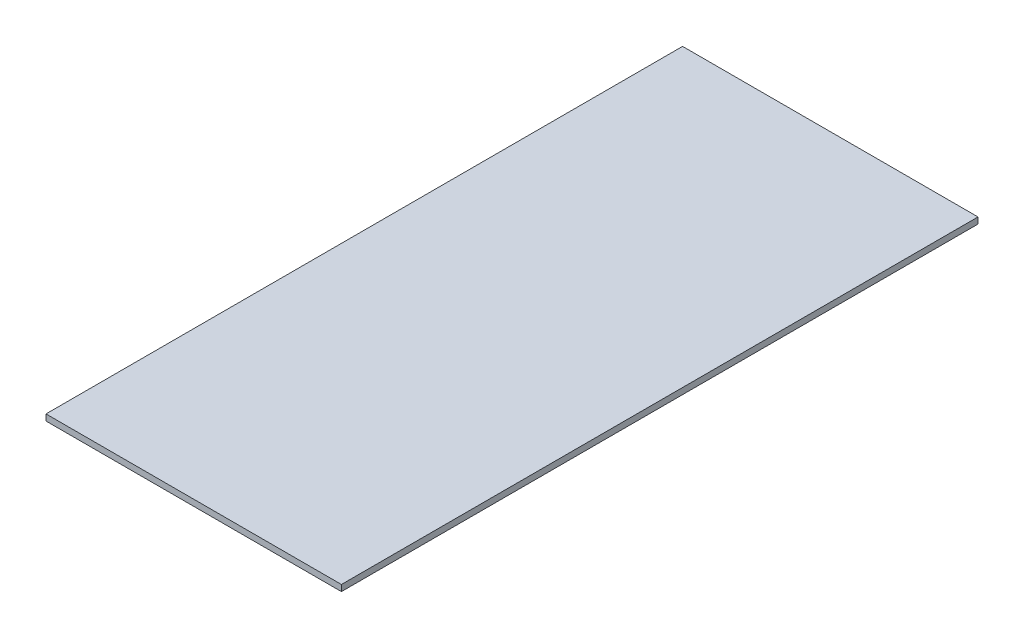
ISO-10303-21;
HEADER;
FILE_DESCRIPTION(('STEP AP214'),'2;1');
FILE_NAME('part.step','',(''),(''),'','','');
FILE_SCHEMA(('AUTOMOTIVE_DESIGN { 1 0 10303 214 1 1 1 1 }'));
ENDSEC;
DATA;
#1=APPLICATION_CONTEXT('core data for automotive mechanical design processes');
#2=APPLICATION_PROTOCOL_DEFINITION('international standard','automotive_design',2000,#1);
#3=PRODUCT_CONTEXT('',#1,'mechanical');
#4=PRODUCT('Part','Part','',(#3));
#5=PRODUCT_RELATED_PRODUCT_CATEGORY('part','',(#4));
#6=PRODUCT_DEFINITION_FORMATION('','',#4);
#7=PRODUCT_DEFINITION_CONTEXT('part definition',#1,'design');
#8=PRODUCT_DEFINITION('design','',#6,#7);
#9=PRODUCT_DEFINITION_SHAPE('','',#8);
#10=(LENGTH_UNIT() NAMED_UNIT(*) SI_UNIT(.MILLI.,.METRE.));
#11=(NAMED_UNIT(*) PLANE_ANGLE_UNIT() SI_UNIT($,.RADIAN.));
#12=(NAMED_UNIT(*) SI_UNIT($,.STERADIAN.) SOLID_ANGLE_UNIT());
#13=UNCERTAINTY_MEASURE_WITH_UNIT(LENGTH_MEASURE(1.E-05),#10,'distance_accuracy_value','');
#14=(GEOMETRIC_REPRESENTATION_CONTEXT(3) GLOBAL_UNCERTAINTY_ASSIGNED_CONTEXT((#13)) GLOBAL_UNIT_ASSIGNED_CONTEXT((#10,
#11,#12)) REPRESENTATION_CONTEXT('',''));
#15=CARTESIAN_POINT('',(0.,0.,0.));
#16=DIRECTION('',(0.,0.,1.));
#17=DIRECTION('',(1.,0.,0.));
#18=AXIS2_PLACEMENT_3D('',#15,#16,#17);
#19=CARTESIAN_POINT('',(84.,-8.,-520.));
#20=DIRECTION('',(-1.,0.,0.));
#21=DIRECTION('',(0.,0.,1.));
#22=AXIS2_PLACEMENT_3D('',#19,#20,#21);
#23=PLANE('',#22);
#24=DIRECTION('',(0.,1.,0.));
#25=VECTOR('',#24,1.);
#26=CARTESIAN_POINT('',(84.,-8.,723.5));
#27=LINE('',#26,#25);
#28=CARTESIAN_POINT('',(84.,-8.,723.5));
#29=VERTEX_POINT('',#28);
#30=CARTESIAN_POINT('',(84.,0.,723.5));
#31=VERTEX_POINT('',#30);
#32=EDGE_CURVE('E27',#29,#31,#27,.T.);
#33=ORIENTED_EDGE('',*,*,#32,.F.);
#34=DIRECTION('',(0.,0.,1.));
#35=VECTOR('',#34,1.);
#36=CARTESIAN_POINT('',(84.,-8.,-520.));
#37=LINE('',#36,#35);
#38=CARTESIAN_POINT('',(84.,-8.,-97.5));
#39=VERTEX_POINT('',#38);
#40=EDGE_CURVE('E74',#39,#29,#37,.T.);
#41=ORIENTED_EDGE('',*,*,#40,.F.);
#42=DIRECTION('',(0.,1.,0.));
#43=VECTOR('',#42,1.);
#44=CARTESIAN_POINT('',(84.,-8.,-97.5));
#45=LINE('',#44,#43);
#46=CARTESIAN_POINT('',(84.,0.,-97.5));
#47=VERTEX_POINT('',#46);
#48=EDGE_CURVE('E11',#39,#47,#45,.T.);
#49=ORIENTED_EDGE('',*,*,#48,.T.);
#50=DIRECTION('',(0.,0.,1.));
#51=VECTOR('',#50,1.);
#52=CARTESIAN_POINT('',(84.,0.,-520.));
#53=LINE('',#52,#51);
#54=EDGE_CURVE('E96',#47,#31,#53,.T.);
#55=ORIENTED_EDGE('',*,*,#54,.T.);
#56=EDGE_LOOP('',(#33,#41,#49,#55));
#57=FACE_BOUND('',#56,.T.);
#58=ADVANCED_FACE('F18',(#57),#23,.F.);
#59=CARTESIAN_POINT('',(0.,-8.,0.));
#60=DIRECTION('',(0.,-1.,0.));
#61=DIRECTION('',(0.,0.,-1.));
#62=AXIS2_PLACEMENT_3D('',#59,#60,#61);
#63=PLANE('',#62);
#64=DIRECTION('',(1.,0.,0.));
#65=VECTOR('',#64,1.);
#66=CARTESIAN_POINT('',(-297.,-8.,-97.5));
#67=LINE('',#66,#65);
#68=CARTESIAN_POINT('',(-297.,-8.,-97.5));
#69=VERTEX_POINT('',#68);
#70=EDGE_CURVE('E71',#69,#39,#67,.T.);
#71=ORIENTED_EDGE('',*,*,#70,.T.);
#72=ORIENTED_EDGE('',*,*,#40,.T.);
#73=DIRECTION('',(-1.,0.,0.));
#74=VECTOR('',#73,1.);
#75=CARTESIAN_POINT('',(297.,-8.,723.5));
#76=LINE('',#75,#74);
#77=CARTESIAN_POINT('',(-297.,-8.,723.5));
#78=VERTEX_POINT('',#77);
#79=EDGE_CURVE('E87',#29,#78,#76,.T.);
#80=ORIENTED_EDGE('',*,*,#79,.T.);
#81=DIRECTION('',(0.,0.,-1.));
#82=VECTOR('',#81,1.);
#83=CARTESIAN_POINT('',(-297.,-8.,520.));
#84=LINE('',#83,#82);
#85=EDGE_CURVE('E77',#78,#69,#84,.T.);
#86=ORIENTED_EDGE('',*,*,#85,.T.);
#87=EDGE_LOOP('',(#71,#72,#80,#86));
#88=FACE_BOUND('',#87,.T.);
#89=DIRECTION('',(0.,0.,-1.));
#90=VECTOR('',#89,1.);
#91=CARTESIAN_POINT('',(82.,-8.,721.5));
#92=LINE('',#91,#90);
#93=CARTESIAN_POINT('',(82.,-8.,721.5));
#94=VERTEX_POINT('',#93);
#95=CARTESIAN_POINT('',(82.,-8.,42.5));
#96=VERTEX_POINT('',#95);
#97=EDGE_CURVE('E148',#94,#96,#92,.T.);
#98=ORIENTED_EDGE('',*,*,#97,.T.);
#99=DIRECTION('',(-1.,0.,0.));
#100=VECTOR('',#99,1.);
#101=CARTESIAN_POINT('',(-295.,-8.,42.5));
#102=LINE('',#101,#100);
#103=CARTESIAN_POINT('',(-295.,-8.,42.5));
#104=VERTEX_POINT('',#103);
#105=EDGE_CURVE('E35',#96,#104,#102,.T.);
#106=ORIENTED_EDGE('',*,*,#105,.T.);
#107=DIRECTION('',(0.,0.,1.));
#108=VECTOR('',#107,1.);
#109=CARTESIAN_POINT('',(-295.,-8.,518.));
#110=LINE('',#109,#108);
#111=CARTESIAN_POINT('',(-295.,-8.,721.5));
#112=VERTEX_POINT('',#111);
#113=EDGE_CURVE('E117',#104,#112,#110,.T.);
#114=ORIENTED_EDGE('',*,*,#113,.T.);
#115=DIRECTION('',(1.,0.,0.));
#116=VECTOR('',#115,1.);
#117=CARTESIAN_POINT('',(-295.,-8.,721.5));
#118=LINE('',#117,#116);
#119=EDGE_CURVE('E109',#112,#94,#118,.T.);
#120=ORIENTED_EDGE('',*,*,#119,.T.);
#121=EDGE_LOOP('',(#98,#106,#114,#120));
#122=FACE_BOUND('',#121,.T.);
#123=ADVANCED_FACE('F73',(#88,#122),#63,.T.);
#124=CARTESIAN_POINT('',(-297.,-8.,-97.5));
#125=DIRECTION('',(0.,0.,1.));
#126=DIRECTION('',(1.,0.,0.));
#127=AXIS2_PLACEMENT_3D('',#124,#125,#126);
#128=PLANE('',#127);
#129=DIRECTION('',(1.,0.,0.));
#130=VECTOR('',#129,1.);
#131=CARTESIAN_POINT('',(-297.,0.,-97.5));
#132=LINE('',#131,#130);
#133=CARTESIAN_POINT('',(-297.,0.,-97.5));
#134=VERTEX_POINT('',#133);
#135=EDGE_CURVE('E90',#134,#47,#132,.T.);
#136=ORIENTED_EDGE('',*,*,#135,.T.);
#137=ORIENTED_EDGE('',*,*,#48,.F.);
#138=ORIENTED_EDGE('',*,*,#70,.F.);
#139=DIRECTION('',(0.,1.,0.));
#140=VECTOR('',#139,1.);
#141=CARTESIAN_POINT('',(-297.,-8.,-97.5));
#142=LINE('',#141,#140);
#143=EDGE_CURVE('E91',#69,#134,#142,.T.);
#144=ORIENTED_EDGE('',*,*,#143,.T.);
#145=EDGE_LOOP('',(#136,#137,#138,#144));
#146=FACE_BOUND('',#145,.T.);
#147=ADVANCED_FACE('F20',(#146),#128,.F.);
#148=CARTESIAN_POINT('',(297.,-8.,723.5));
#149=DIRECTION('',(0.,0.,-1.));
#150=DIRECTION('',(-1.,0.,0.));
#151=AXIS2_PLACEMENT_3D('',#148,#149,#150);
#152=PLANE('',#151);
#153=DIRECTION('',(-1.,0.,0.));
#154=VECTOR('',#153,1.);
#155=CARTESIAN_POINT('',(297.,0.,723.5));
#156=LINE('',#155,#154);
#157=CARTESIAN_POINT('',(-297.,0.,723.5));
#158=VERTEX_POINT('',#157);
#159=EDGE_CURVE('E103',#31,#158,#156,.T.);
#160=ORIENTED_EDGE('',*,*,#159,.T.);
#161=DIRECTION('',(0.,1.,0.));
#162=VECTOR('',#161,1.);
#163=CARTESIAN_POINT('',(-297.,-8.,723.5));
#164=LINE('',#163,#162);
#165=EDGE_CURVE('E110',#78,#158,#164,.T.);
#166=ORIENTED_EDGE('',*,*,#165,.F.);
#167=ORIENTED_EDGE('',*,*,#79,.F.);
#168=ORIENTED_EDGE('',*,*,#32,.T.);
#169=EDGE_LOOP('',(#160,#166,#167,#168));
#170=FACE_BOUND('',#169,.T.);
#171=ADVANCED_FACE('F199',(#170),#152,.F.);
#172=CARTESIAN_POINT('',(-297.,-8.,520.));
#173=DIRECTION('',(1.,0.,0.));
#174=DIRECTION('',(0.,0.,-1.));
#175=AXIS2_PLACEMENT_3D('',#172,#173,#174);
#176=PLANE('',#175);
#177=DIRECTION('',(0.,0.,-1.));
#178=VECTOR('',#177,1.);
#179=CARTESIAN_POINT('',(-297.,0.,520.));
#180=LINE('',#179,#178);
#181=EDGE_CURVE('E82',#158,#134,#180,.T.);
#182=ORIENTED_EDGE('',*,*,#181,.T.);
#183=ORIENTED_EDGE('',*,*,#143,.F.);
#184=ORIENTED_EDGE('',*,*,#85,.F.);
#185=ORIENTED_EDGE('',*,*,#165,.T.);
#186=EDGE_LOOP('',(#182,#183,#184,#185));
#187=FACE_BOUND('',#186,.T.);
#188=ADVANCED_FACE('F195',(#187),#176,.F.);
#189=CARTESIAN_POINT('',(0.,0.,0.));
#190=DIRECTION('',(0.,-1.,0.));
#191=DIRECTION('',(0.,0.,-1.));
#192=AXIS2_PLACEMENT_3D('',#189,#190,#191);
#193=PLANE('',#192);
#194=ORIENTED_EDGE('',*,*,#135,.F.);
#195=ORIENTED_EDGE('',*,*,#181,.F.);
#196=ORIENTED_EDGE('',*,*,#159,.F.);
#197=ORIENTED_EDGE('',*,*,#54,.F.);
#198=EDGE_LOOP('',(#194,#195,#196,#197));
#199=FACE_BOUND('',#198,.T.);
#200=ADVANCED_FACE('F184',(#199),#193,.F.);
#201=CARTESIAN_POINT('',(-295.,-9.,518.));
#202=DIRECTION('',(-1.,0.,0.));
#203=DIRECTION('',(0.,0.,1.));
#204=AXIS2_PLACEMENT_3D('',#201,#202,#203);
#205=PLANE('',#204);
#206=ORIENTED_EDGE('',*,*,#113,.F.);
#207=DIRECTION('',(0.,1.,0.));
#208=VECTOR('',#207,1.);
#209=CARTESIAN_POINT('',(-295.,-9.,42.5));
#210=LINE('',#209,#208);
#211=CARTESIAN_POINT('',(-295.,-9.,42.5));
#212=VERTEX_POINT('',#211);
#213=EDGE_CURVE('E105',#212,#104,#210,.T.);
#214=ORIENTED_EDGE('',*,*,#213,.F.);
#215=DIRECTION('',(0.,0.,1.));
#216=VECTOR('',#215,1.);
#217=CARTESIAN_POINT('',(-295.,-9.,518.));
#218=LINE('',#217,#216);
#219=CARTESIAN_POINT('',(-295.,-9.,721.5));
#220=VERTEX_POINT('',#219);
#221=EDGE_CURVE('E123',#212,#220,#218,.T.);
#222=ORIENTED_EDGE('',*,*,#221,.T.);
#223=DIRECTION('',(0.,1.,0.));
#224=VECTOR('',#223,1.);
#225=CARTESIAN_POINT('',(-295.,-9.,721.5));
#226=LINE('',#225,#224);
#227=EDGE_CURVE('E97',#220,#112,#226,.T.);
#228=ORIENTED_EDGE('',*,*,#227,.T.);
#229=EDGE_LOOP('',(#206,#214,#222,#228));
#230=FACE_BOUND('',#229,.T.);
#231=ADVANCED_FACE('F163',(#230),#205,.T.);
#232=CARTESIAN_POINT('',(-295.,-9.,721.5));
#233=DIRECTION('',(0.,0.,1.));
#234=DIRECTION('',(1.,0.,0.));
#235=AXIS2_PLACEMENT_3D('',#232,#233,#234);
#236=PLANE('',#235);
#237=DIRECTION('',(0.,-1.,0.));
#238=VECTOR('',#237,1.);
#239=CARTESIAN_POINT('',(82.,-8.,721.5));
#240=LINE('',#239,#238);
#241=CARTESIAN_POINT('',(82.,-9.,721.5));
#242=VERTEX_POINT('',#241);
#243=EDGE_CURVE('E142',#94,#242,#240,.T.);
#244=ORIENTED_EDGE('',*,*,#243,.F.);
#245=ORIENTED_EDGE('',*,*,#119,.F.);
#246=ORIENTED_EDGE('',*,*,#227,.F.);
#247=DIRECTION('',(1.,0.,0.));
#248=VECTOR('',#247,1.);
#249=CARTESIAN_POINT('',(-295.,-9.,721.5));
#250=LINE('',#249,#248);
#251=EDGE_CURVE('E127',#220,#242,#250,.T.);
#252=ORIENTED_EDGE('',*,*,#251,.T.);
#253=EDGE_LOOP('',(#244,#245,#246,#252));
#254=FACE_BOUND('',#253,.T.);
#255=ADVANCED_FACE('F169',(#254),#236,.T.);
#256=CARTESIAN_POINT('',(-295.,-9.,42.5));
#257=DIRECTION('',(0.,0.,-1.));
#258=DIRECTION('',(-1.,0.,0.));
#259=AXIS2_PLACEMENT_3D('',#256,#257,#258);
#260=PLANE('',#259);
#261=DIRECTION('',(0.,-1.,0.));
#262=VECTOR('',#261,1.);
#263=CARTESIAN_POINT('',(82.,-8.,42.5));
#264=LINE('',#263,#262);
#265=CARTESIAN_POINT('',(82.,-9.,42.5));
#266=VERTEX_POINT('',#265);
#267=EDGE_CURVE('E145',#96,#266,#264,.T.);
#268=ORIENTED_EDGE('',*,*,#267,.T.);
#269=DIRECTION('',(-1.,0.,0.));
#270=VECTOR('',#269,1.);
#271=CARTESIAN_POINT('',(-295.,-9.,42.5));
#272=LINE('',#271,#270);
#273=EDGE_CURVE('E126',#266,#212,#272,.T.);
#274=ORIENTED_EDGE('',*,*,#273,.T.);
#275=ORIENTED_EDGE('',*,*,#213,.T.);
#276=ORIENTED_EDGE('',*,*,#105,.F.);
#277=EDGE_LOOP('',(#268,#274,#275,#276));
#278=FACE_BOUND('',#277,.T.);
#279=ADVANCED_FACE('F161',(#278),#260,.T.);
#280=CARTESIAN_POINT('',(0.,-9.,0.));
#281=DIRECTION('',(0.,1.,0.));
#282=DIRECTION('',(0.,0.,1.));
#283=AXIS2_PLACEMENT_3D('',#280,#281,#282);
#284=PLANE('',#283);
#285=ORIENTED_EDGE('',*,*,#273,.F.);
#286=DIRECTION('',(0.,0.,-1.));
#287=VECTOR('',#286,1.);
#288=CARTESIAN_POINT('',(82.,-9.,721.5));
#289=LINE('',#288,#287);
#290=EDGE_CURVE('E149',#242,#266,#289,.T.);
#291=ORIENTED_EDGE('',*,*,#290,.F.);
#292=ORIENTED_EDGE('',*,*,#251,.F.);
#293=ORIENTED_EDGE('',*,*,#221,.F.);
#294=EDGE_LOOP('',(#285,#291,#292,#293));
#295=FACE_BOUND('',#294,.T.);
#296=ADVANCED_FACE('F165',(#295),#284,.F.);
#297=CARTESIAN_POINT('',(82.,-8.,721.5));
#298=DIRECTION('',(-1.,0.,0.));
#299=DIRECTION('',(0.,0.,1.));
#300=AXIS2_PLACEMENT_3D('',#297,#298,#299);
#301=PLANE('',#300);
#302=ORIENTED_EDGE('',*,*,#290,.T.);
#303=ORIENTED_EDGE('',*,*,#267,.F.);
#304=ORIENTED_EDGE('',*,*,#97,.F.);
#305=ORIENTED_EDGE('',*,*,#243,.T.);
#306=EDGE_LOOP('',(#302,#303,#304,#305));
#307=FACE_BOUND('',#306,.T.);
#308=ADVANCED_FACE('F167',(#307),#301,.F.);
#309=CLOSED_SHELL('',(#58,#123,#147,#171,#188,#200,#231,#255,#279,#296,#308));
#310=MANIFOLD_SOLID_BREP('B1',#309);
#311=ADVANCED_BREP_SHAPE_REPRESENTATION('',(#18,#310),#14);
#312=SHAPE_DEFINITION_REPRESENTATION(#9,#311);
ENDSEC;
END-ISO-10303-21;
